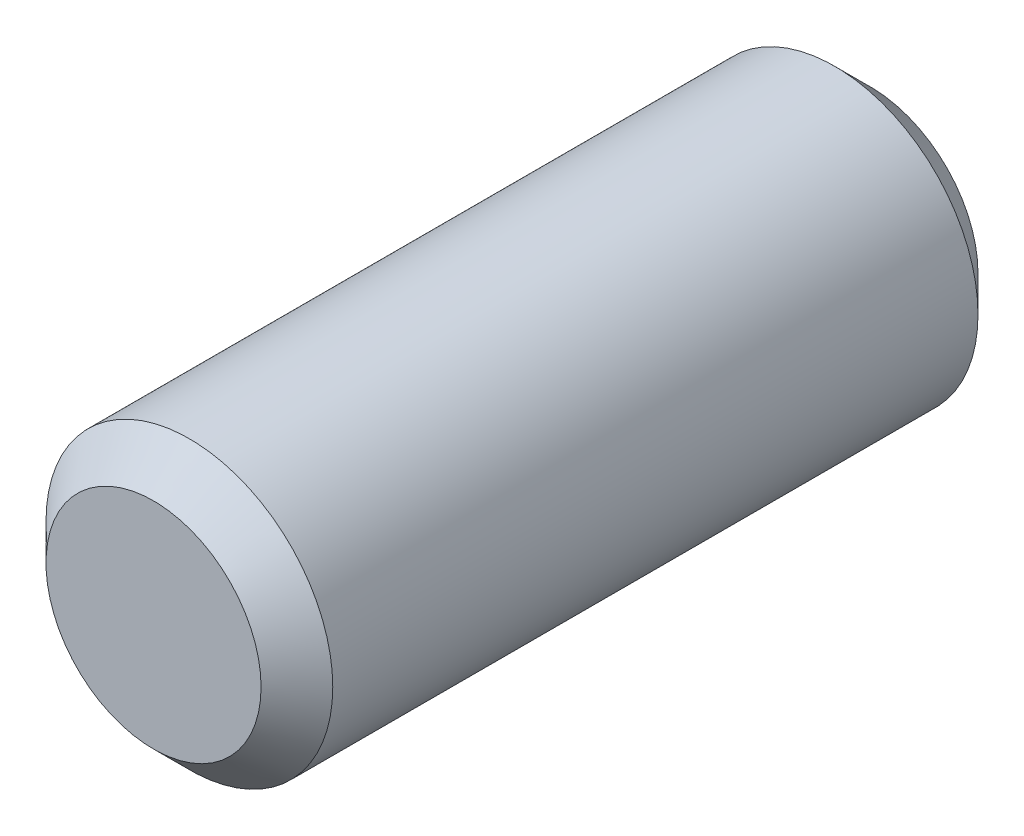
ISO-10303-21;
HEADER;
FILE_DESCRIPTION(('STEP AP214'),'2;1');
FILE_NAME('part.step','',(''),(''),'','','');
FILE_SCHEMA(('AUTOMOTIVE_DESIGN { 1 0 10303 214 1 1 1 1 }'));
ENDSEC;
DATA;
#1=APPLICATION_CONTEXT('core data for automotive mechanical design processes');
#2=APPLICATION_PROTOCOL_DEFINITION('international standard','automotive_design',2000,#1);
#3=PRODUCT_CONTEXT('',#1,'mechanical');
#4=PRODUCT('Part','Part','',(#3));
#5=PRODUCT_RELATED_PRODUCT_CATEGORY('part','',(#4));
#6=PRODUCT_DEFINITION_FORMATION('','',#4);
#7=PRODUCT_DEFINITION_CONTEXT('part definition',#1,'design');
#8=PRODUCT_DEFINITION('design','',#6,#7);
#9=PRODUCT_DEFINITION_SHAPE('','',#8);
#10=(LENGTH_UNIT() NAMED_UNIT(*) SI_UNIT(.MILLI.,.METRE.));
#11=(NAMED_UNIT(*) PLANE_ANGLE_UNIT() SI_UNIT($,.RADIAN.));
#12=(NAMED_UNIT(*) SI_UNIT($,.STERADIAN.) SOLID_ANGLE_UNIT());
#13=UNCERTAINTY_MEASURE_WITH_UNIT(LENGTH_MEASURE(1.E-05),#10,'distance_accuracy_value','');
#14=(GEOMETRIC_REPRESENTATION_CONTEXT(3) GLOBAL_UNCERTAINTY_ASSIGNED_CONTEXT((#13)) GLOBAL_UNIT_ASSIGNED_CONTEXT((#10,
#11,#12)) REPRESENTATION_CONTEXT('',''));
#15=CARTESIAN_POINT('',(0.,0.,0.));
#16=DIRECTION('',(0.,0.,1.));
#17=DIRECTION('',(1.,0.,0.));
#18=AXIS2_PLACEMENT_3D('',#15,#16,#17);
#19=CARTESIAN_POINT('',(0.,0.,10.));
#20=DIRECTION('',(0.,0.,-1.));
#21=DIRECTION('',(-1.,0.,0.));
#22=AXIS2_PLACEMENT_3D('',#19,#20,#21);
#23=CYLINDRICAL_SURFACE('',#22,4.);
#24=CARTESIAN_POINT('',(0.,0.,9.));
#25=DIRECTION('',(0.,0.,1.));
#26=DIRECTION('',(1.,0.,0.));
#27=AXIS2_PLACEMENT_3D('',#24,#25,#26);
#28=CIRCLE('',#27,4.);
#29=CARTESIAN_POINT('',(4.,0.,9.));
#30=VERTEX_POINT('',#29);
#31=EDGE_CURVE('E41',#30,#30,#28,.F.);
#32=ORIENTED_EDGE('',*,*,#31,.T.);
#33=EDGE_LOOP('',(#32));
#34=FACE_BOUND('',#33,.T.);
#35=CARTESIAN_POINT('',(0.,0.,-8.99999999999999));
#36=DIRECTION('',(0.,0.,1.));
#37=DIRECTION('',(1.,0.,0.));
#38=AXIS2_PLACEMENT_3D('',#35,#36,#37);
#39=CIRCLE('',#38,4.);
#40=CARTESIAN_POINT('',(4.,0.,-8.99999999999999));
#41=VERTEX_POINT('',#40);
#42=EDGE_CURVE('E45',#41,#41,#39,.T.);
#43=ORIENTED_EDGE('',*,*,#42,.T.);
#44=EDGE_LOOP('',(#43));
#45=FACE_BOUND('',#44,.T.);
#46=ADVANCED_FACE('F34',(#34,#45),#23,.T.);
#47=CARTESIAN_POINT('',(0.,0.,10.));
#48=DIRECTION('',(0.,0.,1.));
#49=DIRECTION('',(1.,0.,0.));
#50=AXIS2_PLACEMENT_3D('',#47,#48,#49);
#51=PLANE('',#50);
#52=CARTESIAN_POINT('',(0.,0.,10.));
#53=DIRECTION('',(0.,0.,1.));
#54=DIRECTION('',(1.,0.,0.));
#55=AXIS2_PLACEMENT_3D('',#52,#53,#54);
#56=CIRCLE('',#55,3.);
#57=CARTESIAN_POINT('',(3.,0.,10.));
#58=VERTEX_POINT('',#57);
#59=EDGE_CURVE('E49',#58,#58,#56,.T.);
#60=ORIENTED_EDGE('',*,*,#59,.T.);
#61=EDGE_LOOP('',(#60));
#62=FACE_BOUND('',#61,.T.);
#63=ADVANCED_FACE('F55',(#62),#51,.T.);
#64=CARTESIAN_POINT('',(0.,0.,-10.));
#65=DIRECTION('',(0.,0.,1.));
#66=DIRECTION('',(1.,0.,0.));
#67=AXIS2_PLACEMENT_3D('',#64,#65,#66);
#68=PLANE('',#67);
#69=CARTESIAN_POINT('',(0.,0.,-10.));
#70=DIRECTION('',(0.,0.,1.));
#71=DIRECTION('',(1.,0.,0.));
#72=AXIS2_PLACEMENT_3D('',#69,#70,#71);
#73=CIRCLE('',#72,2.99999999999999);
#74=CARTESIAN_POINT('',(2.99999999999999,0.,-10.));
#75=VERTEX_POINT('',#74);
#76=EDGE_CURVE('E10',#75,#75,#73,.F.);
#77=ORIENTED_EDGE('',*,*,#76,.T.);
#78=EDGE_LOOP('',(#77));
#79=FACE_BOUND('',#78,.T.);
#80=ADVANCED_FACE('F59',(#79),#68,.F.);
#81=CARTESIAN_POINT('',(0.,0.,10.));
#82=DIRECTION('',(0.,0.,-1.));
#83=DIRECTION('',(-1.,0.,0.));
#84=AXIS2_PLACEMENT_3D('',#81,#82,#83);
#85=CONICAL_SURFACE('',#84,3.,0.785398163397447);
#86=ORIENTED_EDGE('',*,*,#31,.F.);
#87=EDGE_LOOP('',(#86));
#88=FACE_BOUND('',#87,.T.);
#89=ORIENTED_EDGE('',*,*,#59,.F.);
#90=EDGE_LOOP('',(#89));
#91=FACE_BOUND('',#90,.T.);
#92=ADVANCED_FACE('F57',(#88,#91),#85,.T.);
#93=CARTESIAN_POINT('',(0.,0.,-8.99999999999999));
#94=DIRECTION('',(0.,0.,1.));
#95=DIRECTION('',(1.,0.,0.));
#96=AXIS2_PLACEMENT_3D('',#93,#94,#95);
#97=CONICAL_SURFACE('',#96,4.,0.78539816339745);
#98=ORIENTED_EDGE('',*,*,#76,.F.);
#99=EDGE_LOOP('',(#98));
#100=FACE_BOUND('',#99,.T.);
#101=ORIENTED_EDGE('',*,*,#42,.F.);
#102=EDGE_LOOP('',(#101));
#103=FACE_BOUND('',#102,.T.);
#104=ADVANCED_FACE('F36',(#100,#103),#97,.T.);
#105=CLOSED_SHELL('',(#46,#63,#80,#92,#104));
#106=MANIFOLD_SOLID_BREP('B2',#105);
#107=ADVANCED_BREP_SHAPE_REPRESENTATION('',(#18,#106),#14);
#108=SHAPE_DEFINITION_REPRESENTATION(#9,#107);
ENDSEC;
END-ISO-10303-21;
